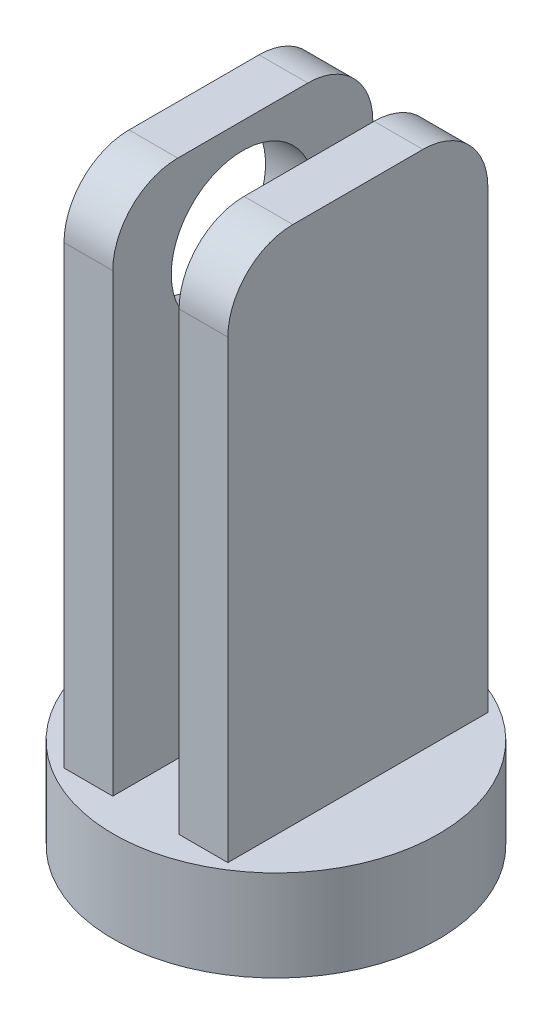
ISO-10303-21;
HEADER;
FILE_DESCRIPTION(('STEP AP214'),'2;1');
FILE_NAME('part.step','',(''),(''),'','','');
FILE_SCHEMA(('AUTOMOTIVE_DESIGN { 1 0 10303 214 1 1 1 1 }'));
ENDSEC;
DATA;
#1=APPLICATION_CONTEXT('core data for automotive mechanical design processes');
#2=APPLICATION_PROTOCOL_DEFINITION('international standard','automotive_design',2000,#1);
#3=PRODUCT_CONTEXT('',#1,'mechanical');
#4=PRODUCT('Part','Part','',(#3));
#5=PRODUCT_RELATED_PRODUCT_CATEGORY('part','',(#4));
#6=PRODUCT_DEFINITION_FORMATION('','',#4);
#7=PRODUCT_DEFINITION_CONTEXT('part definition',#1,'design');
#8=PRODUCT_DEFINITION('design','',#6,#7);
#9=PRODUCT_DEFINITION_SHAPE('','',#8);
#10=(LENGTH_UNIT() NAMED_UNIT(*) SI_UNIT(.MILLI.,.METRE.));
#11=(NAMED_UNIT(*) PLANE_ANGLE_UNIT() SI_UNIT($,.RADIAN.));
#12=(NAMED_UNIT(*) SI_UNIT($,.STERADIAN.) SOLID_ANGLE_UNIT());
#13=UNCERTAINTY_MEASURE_WITH_UNIT(LENGTH_MEASURE(1.E-05),#10,'distance_accuracy_value','');
#14=(GEOMETRIC_REPRESENTATION_CONTEXT(3) GLOBAL_UNCERTAINTY_ASSIGNED_CONTEXT((#13)) GLOBAL_UNIT_ASSIGNED_CONTEXT((#10,
#11,#12)) REPRESENTATION_CONTEXT('',''));
#15=CARTESIAN_POINT('',(0.,0.,0.));
#16=DIRECTION('',(0.,0.,1.));
#17=DIRECTION('',(1.,0.,0.));
#18=AXIS2_PLACEMENT_3D('',#15,#16,#17);
#19=CARTESIAN_POINT('',(0.,14.,0.));
#20=DIRECTION('',(0.,1.,0.));
#21=DIRECTION('',(0.,0.,1.));
#22=AXIS2_PLACEMENT_3D('',#19,#20,#21);
#23=PLANE('',#22);
#24=CARTESIAN_POINT('',(0.,14.,0.));
#25=DIRECTION('',(0.,1.,0.));
#26=DIRECTION('',(0.,0.,1.));
#27=AXIS2_PLACEMENT_3D('',#24,#25,#26);
#28=CIRCLE('',#27,25.);
#29=CARTESIAN_POINT('',(0.,14.,-25.));
#30=VERTEX_POINT('',#29);
#31=EDGE_CURVE('E187',#30,#30,#28,.T.);
#32=ORIENTED_EDGE('',*,*,#31,.T.);
#33=EDGE_LOOP('',(#32));
#34=FACE_BOUND('',#33,.T.);
#35=DIRECTION('',(0.,0.,-1.));
#36=VECTOR('',#35,1.);
#37=CARTESIAN_POINT('',(-5.1,14.,20.));
#38=LINE('',#37,#36);
#39=CARTESIAN_POINT('',(-5.1,14.,20.));
#40=VERTEX_POINT('',#39);
#41=CARTESIAN_POINT('',(-5.1,14.,-20.));
#42=VERTEX_POINT('',#41);
#43=EDGE_CURVE('E165',#40,#42,#38,.T.);
#44=ORIENTED_EDGE('',*,*,#43,.F.);
#45=DIRECTION('',(1.,0.,0.));
#46=VECTOR('',#45,1.);
#47=CARTESIAN_POINT('',(-12.6,14.,20.));
#48=LINE('',#47,#46);
#49=CARTESIAN_POINT('',(-12.6,14.,20.));
#50=VERTEX_POINT('',#49);
#51=EDGE_CURVE('E128',#50,#40,#48,.T.);
#52=ORIENTED_EDGE('',*,*,#51,.F.);
#53=DIRECTION('',(0.,0.,1.));
#54=VECTOR('',#53,1.);
#55=CARTESIAN_POINT('',(-12.6,14.,-20.));
#56=LINE('',#55,#54);
#57=CARTESIAN_POINT('',(-12.6,14.,-20.));
#58=VERTEX_POINT('',#57);
#59=EDGE_CURVE('E159',#58,#50,#56,.T.);
#60=ORIENTED_EDGE('',*,*,#59,.F.);
#61=DIRECTION('',(-1.,0.,0.));
#62=VECTOR('',#61,1.);
#63=CARTESIAN_POINT('',(-5.1,14.,-20.));
#64=LINE('',#63,#62);
#65=EDGE_CURVE('E168',#42,#58,#64,.T.);
#66=ORIENTED_EDGE('',*,*,#65,.F.);
#67=EDGE_LOOP('',(#44,#52,#60,#66));
#68=FACE_BOUND('',#67,.T.);
#69=DIRECTION('',(0.,0.,-1.));
#70=VECTOR('',#69,1.);
#71=CARTESIAN_POINT('',(12.6,14.,20.));
#72=LINE('',#71,#70);
#73=CARTESIAN_POINT('',(12.6,14.,20.));
#74=VERTEX_POINT('',#73);
#75=CARTESIAN_POINT('',(12.6,14.,-20.));
#76=VERTEX_POINT('',#75);
#77=EDGE_CURVE('E124',#74,#76,#72,.T.);
#78=ORIENTED_EDGE('',*,*,#77,.F.);
#79=DIRECTION('',(1.,0.,0.));
#80=VECTOR('',#79,1.);
#81=CARTESIAN_POINT('',(5.1,14.,20.));
#82=LINE('',#81,#80);
#83=CARTESIAN_POINT('',(5.1,14.,20.));
#84=VERTEX_POINT('',#83);
#85=EDGE_CURVE('E132',#84,#74,#82,.T.);
#86=ORIENTED_EDGE('',*,*,#85,.F.);
#87=DIRECTION('',(0.,0.,1.));
#88=VECTOR('',#87,1.);
#89=CARTESIAN_POINT('',(5.1,14.,-20.));
#90=LINE('',#89,#88);
#91=CARTESIAN_POINT('',(5.1,14.,-20.));
#92=VERTEX_POINT('',#91);
#93=EDGE_CURVE('E144',#92,#84,#90,.T.);
#94=ORIENTED_EDGE('',*,*,#93,.F.);
#95=DIRECTION('',(-1.,0.,0.));
#96=VECTOR('',#95,1.);
#97=CARTESIAN_POINT('',(12.6,14.,-20.));
#98=LINE('',#97,#96);
#99=EDGE_CURVE('E142',#76,#92,#98,.T.);
#100=ORIENTED_EDGE('',*,*,#99,.F.);
#101=EDGE_LOOP('',(#78,#86,#94,#100));
#102=FACE_BOUND('',#101,.T.);
#103=ADVANCED_FACE('F32',(#34,#68,#102),#23,.T.);
#104=CARTESIAN_POINT('',(0.,14.,0.));
#105=DIRECTION('',(0.,-1.,0.));
#106=DIRECTION('',(0.,0.,-1.));
#107=AXIS2_PLACEMENT_3D('',#104,#105,#106);
#108=CYLINDRICAL_SURFACE('',#107,25.);
#109=CARTESIAN_POINT('',(0.,0.,0.));
#110=DIRECTION('',(0.,1.,0.));
#111=DIRECTION('',(0.,0.,1.));
#112=AXIS2_PLACEMENT_3D('',#109,#110,#111);
#113=CIRCLE('',#112,25.);
#114=CARTESIAN_POINT('',(0.,0.,-25.));
#115=VERTEX_POINT('',#114);
#116=EDGE_CURVE('E184',#115,#115,#113,.T.);
#117=CARTESIAN_POINT('',(0.,14.,-25.));
#118=CARTESIAN_POINT('',(0.,13.8541666666667,-25.));
#119=CARTESIAN_POINT('',(0.,13.7083333333333,-25.));
#120=CARTESIAN_POINT('',(0.,13.4166666666667,-25.));
#121=CARTESIAN_POINT('',(0.,13.2708333333333,-25.));
#122=CARTESIAN_POINT('',(0.,12.9791666666667,-25.));
#123=CARTESIAN_POINT('',(0.,12.8333333333333,-25.));
#124=CARTESIAN_POINT('',(0.,12.5416666666667,-25.));
#125=CARTESIAN_POINT('',(0.,12.3958333333333,-25.));
#126=CARTESIAN_POINT('',(0.,12.1041666666667,-25.));
#127=CARTESIAN_POINT('',(0.,11.9583333333333,-25.));
#128=CARTESIAN_POINT('',(0.,11.6666666666667,-25.));
#129=CARTESIAN_POINT('',(0.,11.5208333333333,-25.));
#130=CARTESIAN_POINT('',(0.,11.2291666666667,-25.));
#131=CARTESIAN_POINT('',(0.,11.0833333333333,-25.));
#132=CARTESIAN_POINT('',(0.,10.7916666666667,-25.));
#133=CARTESIAN_POINT('',(0.,10.6458333333333,-25.));
#134=CARTESIAN_POINT('',(0.,10.3541666666667,-25.));
#135=CARTESIAN_POINT('',(0.,10.2083333333333,-25.));
#136=CARTESIAN_POINT('',(0.,9.91666666666667,-25.));
#137=CARTESIAN_POINT('',(0.,9.77083333333333,-25.));
#138=CARTESIAN_POINT('',(0.,9.47916666666667,-25.));
#139=CARTESIAN_POINT('',(0.,9.33333333333333,-25.));
#140=CARTESIAN_POINT('',(0.,9.04166666666666,-25.));
#141=CARTESIAN_POINT('',(0.,8.89583333333333,-25.));
#142=CARTESIAN_POINT('',(0.,8.60416666666666,-25.));
#143=CARTESIAN_POINT('',(0.,8.45833333333333,-25.));
#144=CARTESIAN_POINT('',(0.,8.16666666666667,-25.));
#145=CARTESIAN_POINT('',(0.,8.02083333333333,-25.));
#146=CARTESIAN_POINT('',(0.,7.72916666666667,-25.));
#147=CARTESIAN_POINT('',(0.,7.58333333333333,-25.));
#148=CARTESIAN_POINT('',(0.,7.29166666666667,-25.));
#149=CARTESIAN_POINT('',(0.,7.14583333333333,-25.));
#150=CARTESIAN_POINT('',(0.,6.85416666666666,-25.));
#151=CARTESIAN_POINT('',(0.,6.70833333333333,-25.));
#152=CARTESIAN_POINT('',(0.,6.41666666666667,-25.));
#153=CARTESIAN_POINT('',(0.,6.27083333333333,-25.));
#154=CARTESIAN_POINT('',(0.,5.97916666666667,-25.));
#155=CARTESIAN_POINT('',(0.,5.83333333333333,-25.));
#156=CARTESIAN_POINT('',(0.,5.54166666666666,-25.));
#157=CARTESIAN_POINT('',(0.,5.39583333333333,-25.));
#158=CARTESIAN_POINT('',(0.,5.10416666666667,-25.));
#159=CARTESIAN_POINT('',(0.,4.95833333333333,-25.));
#160=CARTESIAN_POINT('',(0.,4.66666666666667,-25.));
#161=CARTESIAN_POINT('',(0.,4.52083333333333,-25.));
#162=CARTESIAN_POINT('',(0.,4.22916666666667,-25.));
#163=CARTESIAN_POINT('',(0.,4.08333333333333,-25.));
#164=CARTESIAN_POINT('',(0.,3.79166666666667,-25.));
#165=CARTESIAN_POINT('',(0.,3.64583333333333,-25.));
#166=CARTESIAN_POINT('',(0.,3.35416666666666,-25.));
#167=CARTESIAN_POINT('',(0.,3.20833333333333,-25.));
#168=CARTESIAN_POINT('',(0.,2.91666666666666,-25.));
#169=CARTESIAN_POINT('',(0.,2.77083333333333,-25.));
#170=CARTESIAN_POINT('',(0.,2.47916666666667,-25.));
#171=CARTESIAN_POINT('',(0.,2.33333333333333,-25.));
#172=CARTESIAN_POINT('',(0.,2.04166666666667,-25.));
#173=CARTESIAN_POINT('',(0.,1.89583333333333,-25.));
#174=CARTESIAN_POINT('',(0.,1.60416666666666,-25.));
#175=CARTESIAN_POINT('',(0.,1.45833333333333,-25.));
#176=CARTESIAN_POINT('',(0.,1.16666666666666,-25.));
#177=CARTESIAN_POINT('',(0.,1.02083333333333,-25.));
#178=CARTESIAN_POINT('',(0.,0.729166666666666,-25.));
#179=CARTESIAN_POINT('',(0.,0.583333333333332,-25.));
#180=CARTESIAN_POINT('',(0.,0.291666666666665,-25.));
#181=CARTESIAN_POINT('',(0.,0.145833333333331,-25.));
#182=CARTESIAN_POINT('',(0.,0.,-25.));
#183=B_SPLINE_CURVE_WITH_KNOTS('',3,(#117,#118,#119,#120,#121,#122,#123,#124,#125,#126,#127,
#128,#129,#130,#131,#132,#133,#134,#135,#136,#137,#138,#139,#140,#141,#142,#143,#144,#145,#146,
#147,#148,#149,#150,#151,#152,#153,#154,#155,#156,#157,#158,#159,#160,#161,#162,#163,#164,#165,
#166,#167,#168,#169,#170,#171,#172,#173,#174,#175,#176,#177,#178,#179,#180,#181,#182),
.UNSPECIFIED.,.F.,.F.,(4,2,2,2,2,2,2,2,2,2,2,2,2,2,2,2,2,2,2,2,2,2,2,2,2,2,2,2,2,2,2,2,4),(0.,
0.437499999999999,0.874999999999999,1.3125,1.75,2.1875,2.625,3.0625,3.5,3.9375,4.375,4.8125,
5.25,5.6875,6.125,6.5625,7.,7.4375,7.875,8.3125,8.75,9.1875,9.625,10.0625,10.5,10.9375,11.375,
11.8125,12.25,12.6875,13.125,13.5625,14.),.UNSPECIFIED.);
#184=EDGE_CURVE('BSEAM264',#30,#115,#183,.T.);
#185=ORIENTED_EDGE('',*,*,#31,.F.);
#186=ORIENTED_EDGE('',*,*,#116,.T.);
#187=ORIENTED_EDGE('',*,*,#184,.T.);
#188=ORIENTED_EDGE('',*,*,#184,.F.);
#189=EDGE_LOOP('',(#185,#187,#186,#188));
#190=FACE_BOUND('',#189,.T.);
#191=ADVANCED_FACE('F264',(#190),#108,.T.);
#192=CARTESIAN_POINT('',(0.,0.,0.));
#193=DIRECTION('',(0.,1.,0.));
#194=DIRECTION('',(0.,0.,1.));
#195=AXIS2_PLACEMENT_3D('',#192,#193,#194);
#196=PLANE('',#195);
#197=CARTESIAN_POINT('',(0.,0.,0.));
#198=DIRECTION('',(0.,-1.,0.));
#199=DIRECTION('',(0.,0.,-1.));
#200=AXIS2_PLACEMENT_3D('',#197,#198,#199);
#201=CIRCLE('',#200,11.);
#202=CARTESIAN_POINT('',(0.,0.,-11.));
#203=VERTEX_POINT('',#202);
#204=EDGE_CURVE('E180',#203,#203,#201,.T.);
#205=ORIENTED_EDGE('',*,*,#204,.F.);
#206=EDGE_LOOP('',(#205));
#207=FACE_BOUND('',#206,.T.);
#208=ORIENTED_EDGE('',*,*,#116,.F.);
#209=EDGE_LOOP('',(#208));
#210=FACE_BOUND('',#209,.T.);
#211=ADVANCED_FACE('F270',(#207,#210),#196,.F.);
#212=CARTESIAN_POINT('',(0.,7.,0.));
#213=DIRECTION('',(0.,-1.,0.));
#214=DIRECTION('',(0.,0.,-1.));
#215=AXIS2_PLACEMENT_3D('',#212,#213,#214);
#216=CYLINDRICAL_SURFACE('',#215,11.);
#217=CARTESIAN_POINT('',(0.,7.,0.));
#218=DIRECTION('',(0.,-1.,0.));
#219=DIRECTION('',(0.,0.,-1.));
#220=AXIS2_PLACEMENT_3D('',#217,#218,#219);
#221=CIRCLE('',#220,11.);
#222=CARTESIAN_POINT('',(0.,7.,-11.));
#223=VERTEX_POINT('',#222);
#224=EDGE_CURVE('E181',#223,#223,#221,.T.);
#225=CARTESIAN_POINT('',(0.,7.,-11.));
#226=CARTESIAN_POINT('',(0.,6.92708333333333,-11.));
#227=CARTESIAN_POINT('',(0.,6.85416666666667,-11.));
#228=CARTESIAN_POINT('',(0.,6.70833333333333,-11.));
#229=CARTESIAN_POINT('',(0.,6.63541666666667,-11.));
#230=CARTESIAN_POINT('',(0.,6.48958333333333,-11.));
#231=CARTESIAN_POINT('',(0.,6.41666666666667,-11.));
#232=CARTESIAN_POINT('',(0.,6.27083333333333,-11.));
#233=CARTESIAN_POINT('',(0.,6.19791666666667,-11.));
#234=CARTESIAN_POINT('',(0.,6.05208333333333,-11.));
#235=CARTESIAN_POINT('',(0.,5.97916666666667,-11.));
#236=CARTESIAN_POINT('',(0.,5.83333333333333,-11.));
#237=CARTESIAN_POINT('',(0.,5.76041666666667,-11.));
#238=CARTESIAN_POINT('',(0.,5.61458333333333,-11.));
#239=CARTESIAN_POINT('',(0.,5.54166666666667,-11.));
#240=CARTESIAN_POINT('',(0.,5.39583333333333,-11.));
#241=CARTESIAN_POINT('',(0.,5.32291666666667,-11.));
#242=CARTESIAN_POINT('',(0.,5.17708333333333,-11.));
#243=CARTESIAN_POINT('',(0.,5.10416666666667,-11.));
#244=CARTESIAN_POINT('',(0.,4.95833333333333,-11.));
#245=CARTESIAN_POINT('',(0.,4.88541666666667,-11.));
#246=CARTESIAN_POINT('',(0.,4.73958333333333,-11.));
#247=CARTESIAN_POINT('',(0.,4.66666666666667,-11.));
#248=CARTESIAN_POINT('',(0.,4.52083333333333,-11.));
#249=CARTESIAN_POINT('',(0.,4.44791666666667,-11.));
#250=CARTESIAN_POINT('',(0.,4.30208333333333,-11.));
#251=CARTESIAN_POINT('',(0.,4.22916666666667,-11.));
#252=CARTESIAN_POINT('',(0.,4.08333333333333,-11.));
#253=CARTESIAN_POINT('',(0.,4.01041666666667,-11.));
#254=CARTESIAN_POINT('',(0.,3.86458333333333,-11.));
#255=CARTESIAN_POINT('',(0.,3.79166666666667,-11.));
#256=CARTESIAN_POINT('',(0.,3.64583333333333,-11.));
#257=CARTESIAN_POINT('',(0.,3.57291666666667,-11.));
#258=CARTESIAN_POINT('',(0.,3.42708333333333,-11.));
#259=CARTESIAN_POINT('',(0.,3.35416666666667,-11.));
#260=CARTESIAN_POINT('',(0.,3.20833333333333,-11.));
#261=CARTESIAN_POINT('',(0.,3.13541666666667,-11.));
#262=CARTESIAN_POINT('',(0.,2.98958333333333,-11.));
#263=CARTESIAN_POINT('',(0.,2.91666666666667,-11.));
#264=CARTESIAN_POINT('',(0.,2.77083333333333,-11.));
#265=CARTESIAN_POINT('',(0.,2.69791666666667,-11.));
#266=CARTESIAN_POINT('',(0.,2.55208333333333,-11.));
#267=CARTESIAN_POINT('',(0.,2.47916666666667,-11.));
#268=CARTESIAN_POINT('',(0.,2.33333333333333,-11.));
#269=CARTESIAN_POINT('',(0.,2.26041666666667,-11.));
#270=CARTESIAN_POINT('',(0.,2.11458333333333,-11.));
#271=CARTESIAN_POINT('',(0.,2.04166666666667,-11.));
#272=CARTESIAN_POINT('',(0.,1.89583333333333,-11.));
#273=CARTESIAN_POINT('',(0.,1.82291666666667,-11.));
#274=CARTESIAN_POINT('',(0.,1.67708333333333,-11.));
#275=CARTESIAN_POINT('',(0.,1.60416666666667,-11.));
#276=CARTESIAN_POINT('',(0.,1.45833333333333,-11.));
#277=CARTESIAN_POINT('',(0.,1.38541666666667,-11.));
#278=CARTESIAN_POINT('',(0.,1.23958333333333,-11.));
#279=CARTESIAN_POINT('',(0.,1.16666666666667,-11.));
#280=CARTESIAN_POINT('',(0.,1.02083333333333,-11.));
#281=CARTESIAN_POINT('',(0.,0.947916666666668,-11.));
#282=CARTESIAN_POINT('',(0.,0.802083333333334,-11.));
#283=CARTESIAN_POINT('',(0.,0.729166666666667,-11.));
#284=CARTESIAN_POINT('',(0.,0.583333333333334,-11.));
#285=CARTESIAN_POINT('',(0.,0.510416666666668,-11.));
#286=CARTESIAN_POINT('',(0.,0.364583333333335,-11.));
#287=CARTESIAN_POINT('',(0.,0.291666666666668,-11.));
#288=CARTESIAN_POINT('',(0.,0.145833333333334,-11.));
#289=CARTESIAN_POINT('',(0.,0.0729166666666675,-11.));
#290=CARTESIAN_POINT('',(0.,0.,-11.));
#291=B_SPLINE_CURVE_WITH_KNOTS('',3,(#225,#226,#227,#228,#229,#230,#231,#232,#233,#234,#235,
#236,#237,#238,#239,#240,#241,#242,#243,#244,#245,#246,#247,#248,#249,#250,#251,#252,#253,#254,
#255,#256,#257,#258,#259,#260,#261,#262,#263,#264,#265,#266,#267,#268,#269,#270,#271,#272,#273,
#274,#275,#276,#277,#278,#279,#280,#281,#282,#283,#284,#285,#286,#287,#288,#289,#290),
.UNSPECIFIED.,.F.,.F.,(4,2,2,2,2,2,2,2,2,2,2,2,2,2,2,2,2,2,2,2,2,2,2,2,2,2,2,2,2,2,2,2,4),(0.,
0.218749999999999,0.4375,0.65625,0.874999999999999,1.09375,1.3125,1.53125,1.75,1.96875,2.1875,
2.40625,2.625,2.84375,3.0625,3.28125,3.5,3.71875,3.9375,4.15625,4.375,4.59375,4.8125,5.03125,
5.25,5.46875,5.6875,5.90625,6.125,6.34375,6.5625,6.78125,7.),.UNSPECIFIED.);
#292=EDGE_CURVE('BSEAM276',#223,#203,#291,.T.);
#293=ORIENTED_EDGE('',*,*,#224,.F.);
#294=ORIENTED_EDGE('',*,*,#204,.T.);
#295=ORIENTED_EDGE('',*,*,#292,.T.);
#296=ORIENTED_EDGE('',*,*,#292,.F.);
#297=EDGE_LOOP('',(#293,#295,#294,#296));
#298=FACE_BOUND('',#297,.T.);
#299=ADVANCED_FACE('F276',(#298),#216,.F.);
#300=CARTESIAN_POINT('',(0.,7.,0.));
#301=DIRECTION('',(0.,-1.,0.));
#302=DIRECTION('',(0.,0.,-1.));
#303=AXIS2_PLACEMENT_3D('',#300,#301,#302);
#304=PLANE('',#303);
#305=ORIENTED_EDGE('',*,*,#224,.T.);
#306=EDGE_LOOP('',(#305));
#307=FACE_BOUND('',#306,.T.);
#308=ADVANCED_FACE('F329',(#307),#304,.T.);
#309=CARTESIAN_POINT('',(-12.6,94.,20.));
#310=DIRECTION('',(0.,0.,-1.));
#311=DIRECTION('',(-1.,0.,0.));
#312=AXIS2_PLACEMENT_3D('',#309,#310,#311);
#313=PLANE('',#312);
#314=DIRECTION('',(0.,-1.,0.));
#315=VECTOR('',#314,1.);
#316=CARTESIAN_POINT('',(-5.1,94.,20.));
#317=LINE('',#316,#315);
#318=CARTESIAN_POINT('',(-5.1,84.,20.));
#319=VERTEX_POINT('',#318);
#320=EDGE_CURVE('E178',#319,#40,#317,.T.);
#321=ORIENTED_EDGE('',*,*,#320,.F.);
#322=DIRECTION('',(1.,0.,0.));
#323=VECTOR('',#322,1.);
#324=CARTESIAN_POINT('',(-12.6,84.,20.));
#325=LINE('',#324,#323);
#326=CARTESIAN_POINT('',(-12.6,84.,20.));
#327=VERTEX_POINT('',#326);
#328=EDGE_CURVE('E11',#319,#327,#325,.F.);
#329=ORIENTED_EDGE('',*,*,#328,.T.);
#330=DIRECTION('',(0.,-1.,0.));
#331=VECTOR('',#330,1.);
#332=CARTESIAN_POINT('',(-12.6,94.,20.));
#333=LINE('',#332,#331);
#334=EDGE_CURVE('E162',#327,#50,#333,.T.);
#335=ORIENTED_EDGE('',*,*,#334,.T.);
#336=ORIENTED_EDGE('',*,*,#51,.T.);
#337=EDGE_LOOP('',(#321,#329,#335,#336));
#338=FACE_BOUND('',#337,.T.);
#339=ADVANCED_FACE('F318',(#338),#313,.F.);
#340=CARTESIAN_POINT('',(-5.1,94.,20.));
#341=DIRECTION('',(-1.,0.,0.));
#342=DIRECTION('',(0.,0.,1.));
#343=AXIS2_PLACEMENT_3D('',#340,#341,#342);
#344=PLANE('',#343);
#345=CARTESIAN_POINT('',(-5.1,79.,0.));
#346=DIRECTION('',(-1.,0.,0.));
#347=DIRECTION('',(0.,0.,1.));
#348=AXIS2_PLACEMENT_3D('',#345,#346,#347);
#349=CIRCLE('',#348,11.);
#350=CARTESIAN_POINT('',(-5.1,79.,11.));
#351=VERTEX_POINT('',#350);
#352=EDGE_CURVE('E139',#351,#351,#349,.T.);
#353=ORIENTED_EDGE('',*,*,#352,.T.);
#354=EDGE_LOOP('',(#353));
#355=FACE_BOUND('',#354,.T.);
#356=DIRECTION('',(0.,-1.,0.));
#357=VECTOR('',#356,1.);
#358=CARTESIAN_POINT('',(-5.1,94.,-20.));
#359=LINE('',#358,#357);
#360=CARTESIAN_POINT('',(-5.1,84.,-20.));
#361=VERTEX_POINT('',#360);
#362=EDGE_CURVE('E176',#361,#42,#359,.T.);
#363=ORIENTED_EDGE('',*,*,#362,.F.);
#364=CARTESIAN_POINT('',(-5.1,84.,-10.));
#365=DIRECTION('',(-1.,0.,0.));
#366=DIRECTION('',(0.,0.,1.));
#367=AXIS2_PLACEMENT_3D('',#364,#365,#366);
#368=CIRCLE('',#367,10.);
#369=CARTESIAN_POINT('',(-5.1,94.,-10.));
#370=VERTEX_POINT('',#369);
#371=EDGE_CURVE('E206',#361,#370,#368,.F.);
#372=ORIENTED_EDGE('',*,*,#371,.T.);
#373=DIRECTION('',(0.,0.,-1.));
#374=VECTOR('',#373,1.);
#375=CARTESIAN_POINT('',(-5.1,94.,20.));
#376=LINE('',#375,#374);
#377=CARTESIAN_POINT('',(-5.1,94.,10.));
#378=VERTEX_POINT('',#377);
#379=EDGE_CURVE('E155',#378,#370,#376,.T.);
#380=ORIENTED_EDGE('',*,*,#379,.F.);
#381=CARTESIAN_POINT('',(-5.1,84.,10.));
#382=DIRECTION('',(-1.,0.,0.));
#383=DIRECTION('',(0.,0.,1.));
#384=AXIS2_PLACEMENT_3D('',#381,#382,#383);
#385=CIRCLE('',#384,10.);
#386=EDGE_CURVE('E204',#378,#319,#385,.F.);
#387=ORIENTED_EDGE('',*,*,#386,.T.);
#388=ORIENTED_EDGE('',*,*,#320,.T.);
#389=ORIENTED_EDGE('',*,*,#43,.T.);
#390=EDGE_LOOP('',(#363,#372,#380,#387,#388,#389));
#391=FACE_BOUND('',#390,.T.);
#392=ADVANCED_FACE('F320',(#355,#391),#344,.F.);
#393=CARTESIAN_POINT('',(-5.1,94.,-20.));
#394=DIRECTION('',(0.,0.,1.));
#395=DIRECTION('',(1.,0.,0.));
#396=AXIS2_PLACEMENT_3D('',#393,#394,#395);
#397=PLANE('',#396);
#398=DIRECTION('',(0.,-1.,0.));
#399=VECTOR('',#398,1.);
#400=CARTESIAN_POINT('',(-12.6,94.,-20.));
#401=LINE('',#400,#399);
#402=CARTESIAN_POINT('',(-12.6,84.,-20.));
#403=VERTEX_POINT('',#402);
#404=EDGE_CURVE('E174',#403,#58,#401,.T.);
#405=ORIENTED_EDGE('',*,*,#404,.F.);
#406=DIRECTION('',(-1.,0.,0.));
#407=VECTOR('',#406,1.);
#408=CARTESIAN_POINT('',(-5.1,84.,-20.));
#409=LINE('',#408,#407);
#410=EDGE_CURVE('E202',#403,#361,#409,.F.);
#411=ORIENTED_EDGE('',*,*,#410,.T.);
#412=ORIENTED_EDGE('',*,*,#362,.T.);
#413=ORIENTED_EDGE('',*,*,#65,.T.);
#414=EDGE_LOOP('',(#405,#411,#412,#413));
#415=FACE_BOUND('',#414,.T.);
#416=ADVANCED_FACE('F310',(#415),#397,.F.);
#417=CARTESIAN_POINT('',(-12.6,94.,-20.));
#418=DIRECTION('',(1.,0.,0.));
#419=DIRECTION('',(0.,0.,-1.));
#420=AXIS2_PLACEMENT_3D('',#417,#418,#419);
#421=PLANE('',#420);
#422=CARTESIAN_POINT('',(-12.6,79.,0.));
#423=DIRECTION('',(-1.,0.,0.));
#424=DIRECTION('',(0.,0.,1.));
#425=AXIS2_PLACEMENT_3D('',#422,#423,#424);
#426=CIRCLE('',#425,11.);
#427=CARTESIAN_POINT('',(-12.6,79.,11.));
#428=VERTEX_POINT('',#427);
#429=EDGE_CURVE('E239',#428,#428,#426,.T.);
#430=ORIENTED_EDGE('',*,*,#429,.F.);
#431=EDGE_LOOP('',(#430));
#432=FACE_BOUND('',#431,.T.);
#433=DIRECTION('',(0.,0.,1.));
#434=VECTOR('',#433,1.);
#435=CARTESIAN_POINT('',(-12.6,94.,-20.));
#436=LINE('',#435,#434);
#437=CARTESIAN_POINT('',(-12.6,94.,-10.));
#438=VERTEX_POINT('',#437);
#439=CARTESIAN_POINT('',(-12.6,94.,10.));
#440=VERTEX_POINT('',#439);
#441=EDGE_CURVE('E158',#438,#440,#436,.T.);
#442=ORIENTED_EDGE('',*,*,#441,.F.);
#443=CARTESIAN_POINT('',(-12.6,84.,-10.));
#444=DIRECTION('',(1.,0.,0.));
#445=DIRECTION('',(0.,0.,-1.));
#446=AXIS2_PLACEMENT_3D('',#443,#444,#445);
#447=CIRCLE('',#446,10.);
#448=EDGE_CURVE('E200',#438,#403,#447,.F.);
#449=ORIENTED_EDGE('',*,*,#448,.T.);
#450=ORIENTED_EDGE('',*,*,#404,.T.);
#451=ORIENTED_EDGE('',*,*,#59,.T.);
#452=ORIENTED_EDGE('',*,*,#334,.F.);
#453=CARTESIAN_POINT('',(-12.6,84.,10.));
#454=DIRECTION('',(1.,0.,0.));
#455=DIRECTION('',(0.,0.,-1.));
#456=AXIS2_PLACEMENT_3D('',#453,#454,#455);
#457=CIRCLE('',#456,10.);
#458=EDGE_CURVE('E198',#327,#440,#457,.F.);
#459=ORIENTED_EDGE('',*,*,#458,.T.);
#460=EDGE_LOOP('',(#442,#449,#450,#451,#452,#459));
#461=FACE_BOUND('',#460,.T.);
#462=ADVANCED_FACE('F301',(#432,#461),#421,.F.);
#463=CARTESIAN_POINT('',(0.,94.,0.));
#464=DIRECTION('',(0.,1.,0.));
#465=DIRECTION('',(0.,0.,1.));
#466=AXIS2_PLACEMENT_3D('',#463,#464,#465);
#467=PLANE('',#466);
#468=ORIENTED_EDGE('',*,*,#379,.T.);
#469=DIRECTION('',(-1.,0.,0.));
#470=VECTOR('',#469,1.);
#471=CARTESIAN_POINT('',(-12.6,94.,-10.));
#472=LINE('',#471,#470);
#473=EDGE_CURVE('E195',#370,#438,#472,.T.);
#474=ORIENTED_EDGE('',*,*,#473,.T.);
#475=ORIENTED_EDGE('',*,*,#441,.T.);
#476=DIRECTION('',(1.,0.,0.));
#477=VECTOR('',#476,1.);
#478=CARTESIAN_POINT('',(-5.1,94.,10.));
#479=LINE('',#478,#477);
#480=EDGE_CURVE('E190',#440,#378,#479,.T.);
#481=ORIENTED_EDGE('',*,*,#480,.T.);
#482=EDGE_LOOP('',(#468,#474,#475,#481));
#483=FACE_BOUND('',#482,.T.);
#484=ADVANCED_FACE('F303',(#483),#467,.T.);
#485=CARTESIAN_POINT('',(5.1,94.,20.));
#486=DIRECTION('',(0.,0.,-1.));
#487=DIRECTION('',(-1.,0.,0.));
#488=AXIS2_PLACEMENT_3D('',#485,#486,#487);
#489=PLANE('',#488);
#490=DIRECTION('',(0.,-1.,0.));
#491=VECTOR('',#490,1.);
#492=CARTESIAN_POINT('',(12.6,94.,20.));
#493=LINE('',#492,#491);
#494=CARTESIAN_POINT('',(12.6,84.,20.));
#495=VERTEX_POINT('',#494);
#496=EDGE_CURVE('E120',#495,#74,#493,.T.);
#497=ORIENTED_EDGE('',*,*,#496,.F.);
#498=DIRECTION('',(1.,0.,0.));
#499=VECTOR('',#498,1.);
#500=CARTESIAN_POINT('',(5.1,84.,20.));
#501=LINE('',#500,#499);
#502=CARTESIAN_POINT('',(5.1,84.,20.));
#503=VERTEX_POINT('',#502);
#504=EDGE_CURVE('E41',#495,#503,#501,.F.);
#505=ORIENTED_EDGE('',*,*,#504,.T.);
#506=DIRECTION('',(0.,-1.,0.));
#507=VECTOR('',#506,1.);
#508=CARTESIAN_POINT('',(5.1,94.,20.));
#509=LINE('',#508,#507);
#510=EDGE_CURVE('E135',#503,#84,#509,.T.);
#511=ORIENTED_EDGE('',*,*,#510,.T.);
#512=ORIENTED_EDGE('',*,*,#85,.T.);
#513=EDGE_LOOP('',(#497,#505,#511,#512));
#514=FACE_BOUND('',#513,.T.);
#515=ADVANCED_FACE('F133',(#514),#489,.F.);
#516=CARTESIAN_POINT('',(12.6,94.,20.));
#517=DIRECTION('',(-1.,0.,0.));
#518=DIRECTION('',(0.,0.,1.));
#519=AXIS2_PLACEMENT_3D('',#516,#517,#518);
#520=PLANE('',#519);
#521=DIRECTION('',(0.,-1.,0.));
#522=VECTOR('',#521,1.);
#523=CARTESIAN_POINT('',(12.6,94.,-20.));
#524=LINE('',#523,#522);
#525=CARTESIAN_POINT('',(12.6,84.,-20.));
#526=VERTEX_POINT('',#525);
#527=EDGE_CURVE('E129',#526,#76,#524,.T.);
#528=ORIENTED_EDGE('',*,*,#527,.F.);
#529=CARTESIAN_POINT('',(12.6,84.,-10.));
#530=DIRECTION('',(-1.,0.,0.));
#531=DIRECTION('',(0.,0.,1.));
#532=AXIS2_PLACEMENT_3D('',#529,#530,#531);
#533=CIRCLE('',#532,10.);
#534=CARTESIAN_POINT('',(12.6,94.,-9.99999999999999));
#535=VERTEX_POINT('',#534);
#536=EDGE_CURVE('E220',#526,#535,#533,.F.);
#537=ORIENTED_EDGE('',*,*,#536,.T.);
#538=DIRECTION('',(0.,0.,-1.));
#539=VECTOR('',#538,1.);
#540=CARTESIAN_POINT('',(12.6,94.,20.));
#541=LINE('',#540,#539);
#542=CARTESIAN_POINT('',(12.6,94.,10.));
#543=VERTEX_POINT('',#542);
#544=EDGE_CURVE('E149',#543,#535,#541,.T.);
#545=ORIENTED_EDGE('',*,*,#544,.F.);
#546=CARTESIAN_POINT('',(12.6,84.,10.));
#547=DIRECTION('',(-1.,0.,0.));
#548=DIRECTION('',(0.,0.,1.));
#549=AXIS2_PLACEMENT_3D('',#546,#547,#548);
#550=CIRCLE('',#549,10.);
#551=EDGE_CURVE('E48',#543,#495,#550,.F.);
#552=ORIENTED_EDGE('',*,*,#551,.T.);
#553=ORIENTED_EDGE('',*,*,#496,.T.);
#554=ORIENTED_EDGE('',*,*,#77,.T.);
#555=EDGE_LOOP('',(#528,#537,#545,#552,#553,#554));
#556=FACE_BOUND('',#555,.T.);
#557=ADVANCED_FACE('F122',(#556),#520,.F.);
#558=CARTESIAN_POINT('',(12.6,94.,-20.));
#559=DIRECTION('',(0.,0.,1.));
#560=DIRECTION('',(1.,0.,0.));
#561=AXIS2_PLACEMENT_3D('',#558,#559,#560);
#562=PLANE('',#561);
#563=DIRECTION('',(0.,-1.,0.));
#564=VECTOR('',#563,1.);
#565=CARTESIAN_POINT('',(5.1,94.,-20.));
#566=LINE('',#565,#564);
#567=CARTESIAN_POINT('',(5.1,84.,-20.));
#568=VERTEX_POINT('',#567);
#569=EDGE_CURVE('E151',#568,#92,#566,.T.);
#570=ORIENTED_EDGE('',*,*,#569,.F.);
#571=DIRECTION('',(-1.,0.,0.));
#572=VECTOR('',#571,1.);
#573=CARTESIAN_POINT('',(12.6,84.,-20.));
#574=LINE('',#573,#572);
#575=EDGE_CURVE('E56',#568,#526,#574,.F.);
#576=ORIENTED_EDGE('',*,*,#575,.T.);
#577=ORIENTED_EDGE('',*,*,#527,.T.);
#578=ORIENTED_EDGE('',*,*,#99,.T.);
#579=EDGE_LOOP('',(#570,#576,#577,#578));
#580=FACE_BOUND('',#579,.T.);
#581=ADVANCED_FACE('F412',(#580),#562,.F.);
#582=CARTESIAN_POINT('',(5.1,94.,-20.));
#583=DIRECTION('',(1.,0.,0.));
#584=DIRECTION('',(0.,0.,-1.));
#585=AXIS2_PLACEMENT_3D('',#582,#583,#584);
#586=PLANE('',#585);
#587=CARTESIAN_POINT('',(5.1,79.,0.));
#588=DIRECTION('',(1.,0.,0.));
#589=DIRECTION('',(0.,0.,-1.));
#590=AXIS2_PLACEMENT_3D('',#587,#588,#589);
#591=CIRCLE('',#590,11.);
#592=CARTESIAN_POINT('',(5.1,79.,-11.));
#593=VERTEX_POINT('',#592);
#594=EDGE_CURVE('E36',#593,#593,#591,.T.);
#595=ORIENTED_EDGE('',*,*,#594,.T.);
#596=EDGE_LOOP('',(#595));
#597=FACE_BOUND('',#596,.T.);
#598=DIRECTION('',(0.,0.,1.));
#599=VECTOR('',#598,1.);
#600=CARTESIAN_POINT('',(5.1,94.,-20.));
#601=LINE('',#600,#599);
#602=CARTESIAN_POINT('',(5.1,94.,-10.));
#603=VERTEX_POINT('',#602);
#604=CARTESIAN_POINT('',(5.1,94.,10.));
#605=VERTEX_POINT('',#604);
#606=EDGE_CURVE('E152',#603,#605,#601,.T.);
#607=ORIENTED_EDGE('',*,*,#606,.F.);
#608=CARTESIAN_POINT('',(5.1,84.,-10.));
#609=DIRECTION('',(1.,0.,0.));
#610=DIRECTION('',(0.,0.,-1.));
#611=AXIS2_PLACEMENT_3D('',#608,#609,#610);
#612=CIRCLE('',#611,10.);
#613=EDGE_CURVE('E216',#603,#568,#612,.F.);
#614=ORIENTED_EDGE('',*,*,#613,.T.);
#615=ORIENTED_EDGE('',*,*,#569,.T.);
#616=ORIENTED_EDGE('',*,*,#93,.T.);
#617=ORIENTED_EDGE('',*,*,#510,.F.);
#618=CARTESIAN_POINT('',(5.1,84.,10.));
#619=DIRECTION('',(1.,0.,0.));
#620=DIRECTION('',(0.,0.,-1.));
#621=AXIS2_PLACEMENT_3D('',#618,#619,#620);
#622=CIRCLE('',#621,10.);
#623=EDGE_CURVE('E214',#503,#605,#622,.F.);
#624=ORIENTED_EDGE('',*,*,#623,.T.);
#625=EDGE_LOOP('',(#607,#614,#615,#616,#617,#624));
#626=FACE_BOUND('',#625,.T.);
#627=ADVANCED_FACE('F226',(#597,#626),#586,.F.);
#628=CARTESIAN_POINT('',(0.,94.,0.));
#629=DIRECTION('',(0.,1.,0.));
#630=DIRECTION('',(0.,0.,1.));
#631=AXIS2_PLACEMENT_3D('',#628,#629,#630);
#632=PLANE('',#631);
#633=ORIENTED_EDGE('',*,*,#544,.T.);
#634=DIRECTION('',(-1.,0.,0.));
#635=VECTOR('',#634,1.);
#636=CARTESIAN_POINT('',(5.09999999999999,94.,-10.));
#637=LINE('',#636,#635);
#638=EDGE_CURVE('E211',#535,#603,#637,.T.);
#639=ORIENTED_EDGE('',*,*,#638,.T.);
#640=ORIENTED_EDGE('',*,*,#606,.T.);
#641=DIRECTION('',(1.,0.,0.));
#642=VECTOR('',#641,1.);
#643=CARTESIAN_POINT('',(12.6,94.,10.));
#644=LINE('',#643,#642);
#645=EDGE_CURVE('E208',#605,#543,#644,.T.);
#646=ORIENTED_EDGE('',*,*,#645,.T.);
#647=EDGE_LOOP('',(#633,#639,#640,#646));
#648=FACE_BOUND('',#647,.T.);
#649=ADVANCED_FACE('F232',(#648),#632,.T.);
#650=CARTESIAN_POINT('',(0.,84.,-10.));
#651=DIRECTION('',(1.,0.,0.));
#652=DIRECTION('',(0.,0.,-1.));
#653=AXIS2_PLACEMENT_3D('',#650,#651,#652);
#654=CYLINDRICAL_SURFACE('',#653,10.);
#655=ORIENTED_EDGE('',*,*,#371,.F.);
#656=ORIENTED_EDGE('',*,*,#410,.F.);
#657=ORIENTED_EDGE('',*,*,#448,.F.);
#658=ORIENTED_EDGE('',*,*,#473,.F.);
#659=EDGE_LOOP('',(#655,#656,#657,#658));
#660=FACE_BOUND('',#659,.T.);
#661=ADVANCED_FACE('F281',(#660),#654,.T.);
#662=CARTESIAN_POINT('',(0.,84.,-10.));
#663=DIRECTION('',(1.,0.,0.));
#664=DIRECTION('',(0.,0.,-1.));
#665=AXIS2_PLACEMENT_3D('',#662,#663,#664);
#666=CYLINDRICAL_SURFACE('',#665,10.);
#667=ORIENTED_EDGE('',*,*,#536,.F.);
#668=ORIENTED_EDGE('',*,*,#575,.F.);
#669=ORIENTED_EDGE('',*,*,#613,.F.);
#670=ORIENTED_EDGE('',*,*,#638,.F.);
#671=EDGE_LOOP('',(#667,#668,#669,#670));
#672=FACE_BOUND('',#671,.T.);
#673=ADVANCED_FACE('F284',(#672),#666,.T.);
#674=CARTESIAN_POINT('',(0.,84.,10.));
#675=DIRECTION('',(-1.,0.,0.));
#676=DIRECTION('',(0.,0.,1.));
#677=AXIS2_PLACEMENT_3D('',#674,#675,#676);
#678=CYLINDRICAL_SURFACE('',#677,10.);
#679=ORIENTED_EDGE('',*,*,#623,.F.);
#680=ORIENTED_EDGE('',*,*,#504,.F.);
#681=ORIENTED_EDGE('',*,*,#551,.F.);
#682=ORIENTED_EDGE('',*,*,#645,.F.);
#683=EDGE_LOOP('',(#679,#680,#681,#682));
#684=FACE_BOUND('',#683,.T.);
#685=ADVANCED_FACE('F229',(#684),#678,.T.);
#686=CARTESIAN_POINT('',(0.,84.,10.));
#687=DIRECTION('',(-1.,0.,0.));
#688=DIRECTION('',(0.,0.,1.));
#689=AXIS2_PLACEMENT_3D('',#686,#687,#688);
#690=CYLINDRICAL_SURFACE('',#689,10.);
#691=ORIENTED_EDGE('',*,*,#458,.F.);
#692=ORIENTED_EDGE('',*,*,#328,.F.);
#693=ORIENTED_EDGE('',*,*,#386,.F.);
#694=ORIENTED_EDGE('',*,*,#480,.F.);
#695=EDGE_LOOP('',(#691,#692,#693,#694));
#696=FACE_BOUND('',#695,.T.);
#697=ADVANCED_FACE('F34',(#696),#690,.T.);
#698=CARTESIAN_POINT('',(11.9,79.,0.));
#699=DIRECTION('',(-1.,0.,0.));
#700=DIRECTION('',(0.,0.,1.));
#701=AXIS2_PLACEMENT_3D('',#698,#699,#700);
#702=PLANE('',#701);
#703=CARTESIAN_POINT('',(11.9,79.,0.));
#704=DIRECTION('',(-1.,0.,0.));
#705=DIRECTION('',(0.,0.,1.));
#706=AXIS2_PLACEMENT_3D('',#703,#704,#705);
#707=CIRCLE('',#706,11.);
#708=CARTESIAN_POINT('',(11.9,79.,11.));
#709=VERTEX_POINT('',#708);
#710=EDGE_CURVE('E242',#709,#709,#707,.T.);
#711=ORIENTED_EDGE('',*,*,#710,.T.);
#712=EDGE_LOOP('',(#711));
#713=FACE_BOUND('',#712,.T.);
#714=ADVANCED_FACE('F253',(#713),#702,.T.);
#715=CARTESIAN_POINT('',(11.9,79.,0.));
#716=DIRECTION('',(-1.,0.,0.));
#717=DIRECTION('',(0.,0.,1.));
#718=AXIS2_PLACEMENT_3D('',#715,#716,#717);
#719=CYLINDRICAL_SURFACE('',#718,11.);
#720=ORIENTED_EDGE('',*,*,#710,.F.);
#721=EDGE_LOOP('',(#720));
#722=FACE_BOUND('',#721,.T.);
#723=ORIENTED_EDGE('',*,*,#594,.F.);
#724=EDGE_LOOP('',(#723));
#725=FACE_BOUND('',#724,.T.);
#726=ADVANCED_FACE('F250',(#722,#725),#719,.F.);
#727=ORIENTED_EDGE('',*,*,#429,.T.);
#728=EDGE_LOOP('',(#727));
#729=FACE_BOUND('',#728,.T.);
#730=ORIENTED_EDGE('',*,*,#352,.F.);
#731=EDGE_LOOP('',(#730));
#732=FACE_BOUND('',#731,.T.);
#733=ADVANCED_FACE('F252',(#729,#732),#719,.F.);
#734=CLOSED_SHELL('',(#103,#191,#211,#299,#308,#339,#392,#416,#462,#484,#515,#557,#581,#627,
#649,#661,#673,#685,#697,#714,#726,#733));
#735=MANIFOLD_SOLID_BREP('B2',#734);
#736=ADVANCED_BREP_SHAPE_REPRESENTATION('',(#18,#735),#14);
#737=SHAPE_DEFINITION_REPRESENTATION(#9,#736);
ENDSEC;
END-ISO-10303-21;
